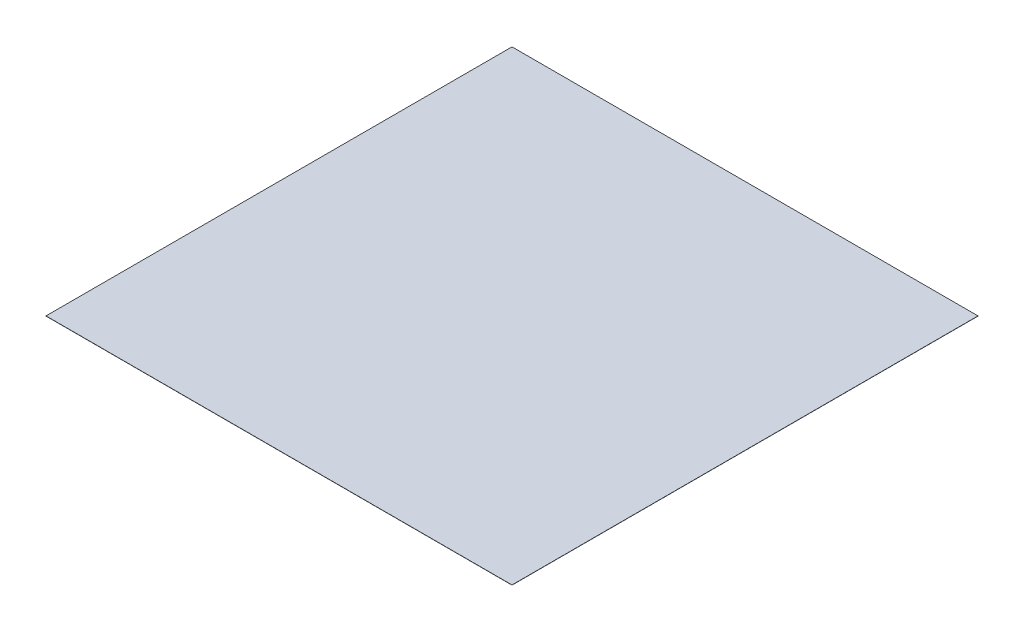
ISO-10303-21;
HEADER;
FILE_DESCRIPTION(('STEP AP214'),'2;1');
FILE_NAME('part.step','',(''),(''),'','','');
FILE_SCHEMA(('AUTOMOTIVE_DESIGN { 1 0 10303 214 1 1 1 1 }'));
ENDSEC;
DATA;
#1=APPLICATION_CONTEXT('core data for automotive mechanical design processes');
#2=APPLICATION_PROTOCOL_DEFINITION('international standard','automotive_design',2000,#1);
#3=PRODUCT_CONTEXT('',#1,'mechanical');
#4=PRODUCT('Part','Part','',(#3));
#5=PRODUCT_RELATED_PRODUCT_CATEGORY('part','',(#4));
#6=PRODUCT_DEFINITION_FORMATION('','',#4);
#7=PRODUCT_DEFINITION_CONTEXT('part definition',#1,'design');
#8=PRODUCT_DEFINITION('design','',#6,#7);
#9=PRODUCT_DEFINITION_SHAPE('','',#8);
#10=(LENGTH_UNIT() NAMED_UNIT(*) SI_UNIT(.MILLI.,.METRE.));
#11=(NAMED_UNIT(*) PLANE_ANGLE_UNIT() SI_UNIT($,.RADIAN.));
#12=(NAMED_UNIT(*) SI_UNIT($,.STERADIAN.) SOLID_ANGLE_UNIT());
#13=UNCERTAINTY_MEASURE_WITH_UNIT(LENGTH_MEASURE(1.E-05),#10,'distance_accuracy_value','');
#14=(GEOMETRIC_REPRESENTATION_CONTEXT(3) GLOBAL_UNCERTAINTY_ASSIGNED_CONTEXT((#13)) GLOBAL_UNIT_ASSIGNED_CONTEXT((#10,
#11,#12)) REPRESENTATION_CONTEXT('',''));
#15=CARTESIAN_POINT('',(0.,0.,0.));
#16=DIRECTION('',(0.,0.,1.));
#17=DIRECTION('',(1.,0.,0.));
#18=AXIS2_PLACEMENT_3D('',#15,#16,#17);
#19=CARTESIAN_POINT('',(-1.25,0.,-1.25));
#20=DIRECTION('',(0.,1.,0.));
#21=DIRECTION('',(0.,0.,1.));
#22=AXIS2_PLACEMENT_3D('',#19,#20,#21);
#23=PLANE('',#22);
#24=DIRECTION('',(1.,0.,0.));
#25=VECTOR('',#24,1.);
#26=CARTESIAN_POINT('',(-2.5,0.,0.));
#27=LINE('',#26,#25);
#28=CARTESIAN_POINT('',(-2.5,0.,0.));
#29=VERTEX_POINT('',#28);
#30=CARTESIAN_POINT('',(0.,0.,0.));
#31=VERTEX_POINT('',#30);
#32=EDGE_CURVE('E83',#29,#31,#27,.T.);
#33=ORIENTED_EDGE('',*,*,#32,.F.);
#34=DIRECTION('',(0.,0.,1.));
#35=VECTOR('',#34,1.);
#36=CARTESIAN_POINT('',(-2.5,0.,-2.5));
#37=LINE('',#36,#35);
#38=CARTESIAN_POINT('',(-2.5,0.,-2.5));
#39=VERTEX_POINT('',#38);
#40=EDGE_CURVE('E64',#39,#29,#37,.T.);
#41=ORIENTED_EDGE('',*,*,#40,.F.);
#42=DIRECTION('',(-1.,0.,0.));
#43=VECTOR('',#42,1.);
#44=CARTESIAN_POINT('',(0.,0.,-2.5));
#45=LINE('',#44,#43);
#46=CARTESIAN_POINT('',(0.,0.,-2.5));
#47=VERTEX_POINT('',#46);
#48=EDGE_CURVE('E65',#47,#39,#45,.T.);
#49=ORIENTED_EDGE('',*,*,#48,.F.);
#50=DIRECTION('',(0.,0.,-1.));
#51=VECTOR('',#50,1.);
#52=CARTESIAN_POINT('',(0.,0.,0.));
#53=LINE('',#52,#51);
#54=EDGE_CURVE('E61',#31,#47,#53,.T.);
#55=ORIENTED_EDGE('',*,*,#54,.F.);
#56=EDGE_LOOP('',(#33,#41,#49,#55));
#57=FACE_BOUND('',#56,.T.);
#58=ADVANCED_FACE('F16',(#57),#23,.F.);
#59=CARTESIAN_POINT('',(0.,0.,0.));
#60=DIRECTION('',(1.,0.,0.));
#61=DIRECTION('',(0.,0.,-1.));
#62=AXIS2_PLACEMENT_3D('',#59,#60,#61);
#63=PLANE('',#62);
#64=DIRECTION('',(0.,0.,1.));
#65=VECTOR('',#64,1.);
#66=CARTESIAN_POINT('',(0.,0.001,-1.25));
#67=LINE('',#66,#65);
#68=CARTESIAN_POINT('',(0.,0.001,0.));
#69=VERTEX_POINT('',#68);
#70=CARTESIAN_POINT('',(0.,0.001,-2.5));
#71=VERTEX_POINT('',#70);
#72=EDGE_CURVE('E59',#69,#71,#67,.F.);
#73=ORIENTED_EDGE('',*,*,#72,.F.);
#74=DIRECTION('',(0.,1.,0.));
#75=VECTOR('',#74,1.);
#76=CARTESIAN_POINT('',(0.,0.,0.));
#77=LINE('',#76,#75);
#78=EDGE_CURVE('E76',#31,#69,#77,.T.);
#79=ORIENTED_EDGE('',*,*,#78,.F.);
#80=ORIENTED_EDGE('',*,*,#54,.T.);
#81=DIRECTION('',(0.,1.,0.));
#82=VECTOR('',#81,1.);
#83=CARTESIAN_POINT('',(0.,0.,-2.5));
#84=LINE('',#83,#82);
#85=EDGE_CURVE('E19',#71,#47,#84,.F.);
#86=ORIENTED_EDGE('',*,*,#85,.F.);
#87=EDGE_LOOP('',(#73,#79,#80,#86));
#88=FACE_BOUND('',#87,.T.);
#89=ADVANCED_FACE('F56',(#88),#63,.T.);
#90=CARTESIAN_POINT('',(0.,0.,-2.5));
#91=DIRECTION('',(0.,0.,-1.));
#92=DIRECTION('',(-1.,0.,0.));
#93=AXIS2_PLACEMENT_3D('',#90,#91,#92);
#94=PLANE('',#93);
#95=DIRECTION('',(1.,0.,0.));
#96=VECTOR('',#95,1.);
#97=CARTESIAN_POINT('',(-1.25,0.001,-2.5));
#98=LINE('',#97,#96);
#99=CARTESIAN_POINT('',(-2.5,0.001,-2.5));
#100=VERTEX_POINT('',#99);
#101=EDGE_CURVE('E67',#71,#100,#98,.F.);
#102=ORIENTED_EDGE('',*,*,#101,.F.);
#103=ORIENTED_EDGE('',*,*,#85,.T.);
#104=ORIENTED_EDGE('',*,*,#48,.T.);
#105=DIRECTION('',(0.,1.,0.));
#106=VECTOR('',#105,1.);
#107=CARTESIAN_POINT('',(-2.5,0.,-2.5));
#108=LINE('',#107,#106);
#109=EDGE_CURVE('E70',#100,#39,#108,.F.);
#110=ORIENTED_EDGE('',*,*,#109,.F.);
#111=EDGE_LOOP('',(#102,#103,#104,#110));
#112=FACE_BOUND('',#111,.T.);
#113=ADVANCED_FACE('F68',(#112),#94,.T.);
#114=CARTESIAN_POINT('',(-2.5,0.,-2.5));
#115=DIRECTION('',(-1.,0.,0.));
#116=DIRECTION('',(0.,0.,1.));
#117=AXIS2_PLACEMENT_3D('',#114,#115,#116);
#118=PLANE('',#117);
#119=DIRECTION('',(0.,0.,1.));
#120=VECTOR('',#119,1.);
#121=CARTESIAN_POINT('',(-2.5,0.001,-1.25));
#122=LINE('',#121,#120);
#123=CARTESIAN_POINT('',(-2.5,0.001,0.));
#124=VERTEX_POINT('',#123);
#125=EDGE_CURVE('E25',#100,#124,#122,.T.);
#126=ORIENTED_EDGE('',*,*,#125,.F.);
#127=ORIENTED_EDGE('',*,*,#109,.T.);
#128=ORIENTED_EDGE('',*,*,#40,.T.);
#129=DIRECTION('',(0.,1.,0.));
#130=VECTOR('',#129,1.);
#131=CARTESIAN_POINT('',(-2.5,0.,0.));
#132=LINE('',#131,#130);
#133=EDGE_CURVE('E34',#124,#29,#132,.F.);
#134=ORIENTED_EDGE('',*,*,#133,.F.);
#135=EDGE_LOOP('',(#126,#127,#128,#134));
#136=FACE_BOUND('',#135,.T.);
#137=ADVANCED_FACE('F87',(#136),#118,.T.);
#138=CARTESIAN_POINT('',(-2.5,0.,0.));
#139=DIRECTION('',(0.,0.,1.));
#140=DIRECTION('',(1.,0.,0.));
#141=AXIS2_PLACEMENT_3D('',#138,#139,#140);
#142=PLANE('',#141);
#143=DIRECTION('',(1.,0.,0.));
#144=VECTOR('',#143,1.);
#145=CARTESIAN_POINT('',(-1.25,0.001,0.));
#146=LINE('',#145,#144);
#147=EDGE_CURVE('E10',#124,#69,#146,.T.);
#148=ORIENTED_EDGE('',*,*,#147,.F.);
#149=ORIENTED_EDGE('',*,*,#133,.T.);
#150=ORIENTED_EDGE('',*,*,#32,.T.);
#151=ORIENTED_EDGE('',*,*,#78,.T.);
#152=EDGE_LOOP('',(#148,#149,#150,#151));
#153=FACE_BOUND('',#152,.T.);
#154=ADVANCED_FACE('F89',(#153),#142,.T.);
#155=CARTESIAN_POINT('',(-1.25,0.001,-1.25));
#156=DIRECTION('',(0.,1.,0.));
#157=DIRECTION('',(0.,0.,1.));
#158=AXIS2_PLACEMENT_3D('',#155,#156,#157);
#159=PLANE('',#158);
#160=ORIENTED_EDGE('',*,*,#125,.T.);
#161=ORIENTED_EDGE('',*,*,#147,.T.);
#162=ORIENTED_EDGE('',*,*,#72,.T.);
#163=ORIENTED_EDGE('',*,*,#101,.T.);
#164=EDGE_LOOP('',(#160,#161,#162,#163));
#165=FACE_BOUND('',#164,.T.);
#166=ADVANCED_FACE('F74',(#165),#159,.T.);
#167=CLOSED_SHELL('',(#58,#89,#113,#137,#154,#166));
#168=MANIFOLD_SOLID_BREP('B1',#167);
#169=ADVANCED_BREP_SHAPE_REPRESENTATION('',(#18,#168),#14);
#170=SHAPE_DEFINITION_REPRESENTATION(#9,#169);
ENDSEC;
END-ISO-10303-21;
